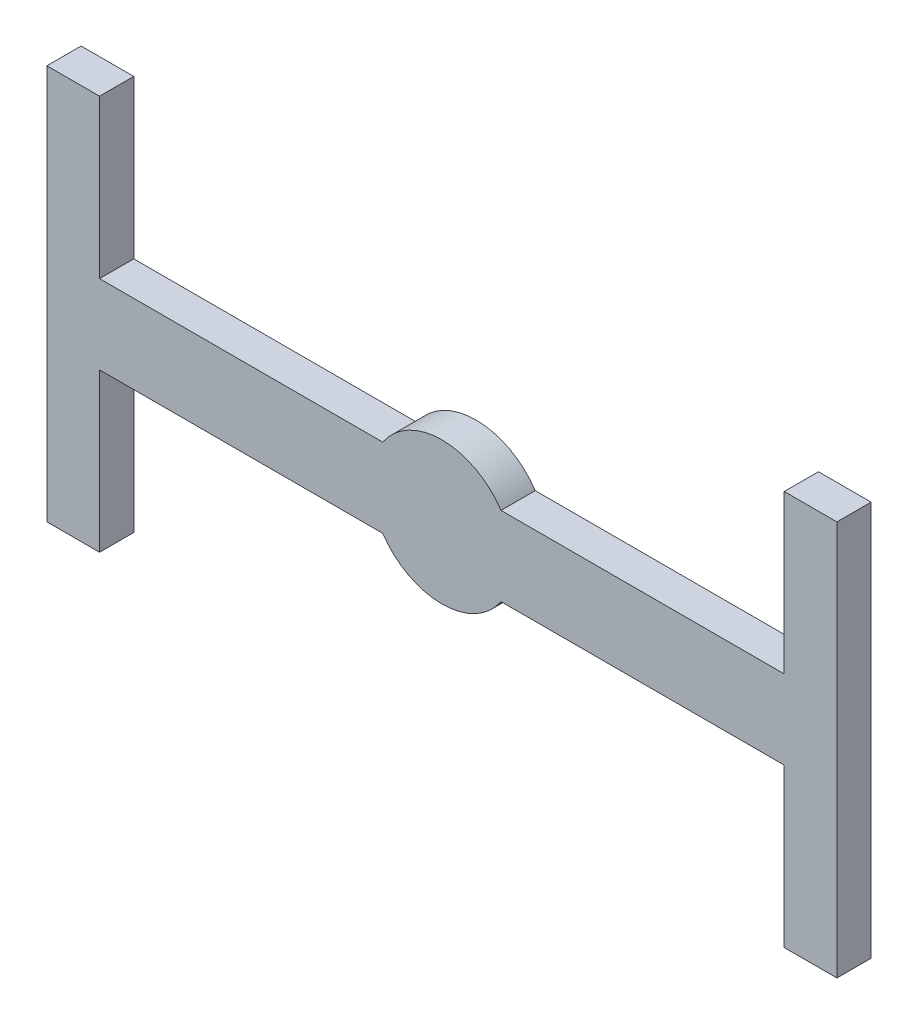
ISO-10303-21;
HEADER;
FILE_DESCRIPTION(('STEP AP214'),'2;1');
FILE_NAME('part.step','',(''),(''),'','','');
FILE_SCHEMA(('AUTOMOTIVE_DESIGN { 1 0 10303 214 1 1 1 1 }'));
ENDSEC;
DATA;
#1=APPLICATION_CONTEXT('core data for automotive mechanical design processes');
#2=APPLICATION_PROTOCOL_DEFINITION('international standard','automotive_design',2000,#1);
#3=PRODUCT_CONTEXT('',#1,'mechanical');
#4=PRODUCT('Part','Part','',(#3));
#5=PRODUCT_RELATED_PRODUCT_CATEGORY('part','',(#4));
#6=PRODUCT_DEFINITION_FORMATION('','',#4);
#7=PRODUCT_DEFINITION_CONTEXT('part definition',#1,'design');
#8=PRODUCT_DEFINITION('design','',#6,#7);
#9=PRODUCT_DEFINITION_SHAPE('','',#8);
#10=(LENGTH_UNIT() NAMED_UNIT(*) SI_UNIT(.MILLI.,.METRE.));
#11=(NAMED_UNIT(*) PLANE_ANGLE_UNIT() SI_UNIT($,.RADIAN.));
#12=(NAMED_UNIT(*) SI_UNIT($,.STERADIAN.) SOLID_ANGLE_UNIT());
#13=UNCERTAINTY_MEASURE_WITH_UNIT(LENGTH_MEASURE(1.E-05),#10,'distance_accuracy_value','');
#14=(GEOMETRIC_REPRESENTATION_CONTEXT(3) GLOBAL_UNCERTAINTY_ASSIGNED_CONTEXT((#13)) GLOBAL_UNIT_ASSIGNED_CONTEXT((#10,
#11,#12)) REPRESENTATION_CONTEXT('',''));
#15=CARTESIAN_POINT('',(0.,0.,0.));
#16=DIRECTION('',(0.,0.,1.));
#17=DIRECTION('',(1.,0.,0.));
#18=AXIS2_PLACEMENT_3D('',#15,#16,#17);
#19=CARTESIAN_POINT('',(-8.88178419700125E-13,1500.,-130.));
#20=DIRECTION('',(0.,-1.,0.));
#21=DIRECTION('',(0.,0.,-1.));
#22=AXIS2_PLACEMENT_3D('',#19,#20,#21);
#23=PLANE('',#22);
#24=DIRECTION('',(1.,0.,0.));
#25=VECTOR('',#24,1.);
#26=CARTESIAN_POINT('',(-8.88178419700125E-13,1500.,0.));
#27=LINE('',#26,#25);
#28=CARTESIAN_POINT('',(-8.88178419700125E-13,1500.,0.));
#29=VERTEX_POINT('',#28);
#30=CARTESIAN_POINT('',(200.,1500.,0.));
#31=VERTEX_POINT('',#30);
#32=EDGE_CURVE('E256',#29,#31,#27,.T.);
#33=ORIENTED_EDGE('',*,*,#32,.T.);
#34=DIRECTION('',(0.,0.,1.));
#35=VECTOR('',#34,1.);
#36=CARTESIAN_POINT('',(200.,1500.,-130.));
#37=LINE('',#36,#35);
#38=CARTESIAN_POINT('',(200.,1500.,-130.));
#39=VERTEX_POINT('',#38);
#40=EDGE_CURVE('E196',#39,#31,#37,.T.);
#41=ORIENTED_EDGE('',*,*,#40,.F.);
#42=DIRECTION('',(1.,0.,0.));
#43=VECTOR('',#42,1.);
#44=CARTESIAN_POINT('',(-8.88178419700125E-13,1500.,-130.));
#45=LINE('',#44,#43);
#46=CARTESIAN_POINT('',(-8.88178419700125E-13,1500.,-130.));
#47=VERTEX_POINT('',#46);
#48=EDGE_CURVE('E242',#47,#39,#45,.T.);
#49=ORIENTED_EDGE('',*,*,#48,.F.);
#50=DIRECTION('',(0.,0.,1.));
#51=VECTOR('',#50,1.);
#52=CARTESIAN_POINT('',(-8.88178419700125E-13,1500.,-130.));
#53=LINE('',#52,#51);
#54=EDGE_CURVE('E11',#47,#29,#53,.T.);
#55=ORIENTED_EDGE('',*,*,#54,.T.);
#56=EDGE_LOOP('',(#33,#41,#49,#55));
#57=FACE_BOUND('',#56,.T.);
#58=ADVANCED_FACE('F37',(#57),#23,.F.);
#59=CARTESIAN_POINT('',(0.,0.,-130.));
#60=DIRECTION('',(0.,-1.,0.));
#61=DIRECTION('',(0.,0.,-1.));
#62=AXIS2_PLACEMENT_3D('',#59,#60,#61);
#63=PLANE('',#62);
#64=DIRECTION('',(1.,0.,0.));
#65=VECTOR('',#64,1.);
#66=CARTESIAN_POINT('',(0.,0.,0.));
#67=LINE('',#66,#65);
#68=CARTESIAN_POINT('',(2800.,0.,0.));
#69=VERTEX_POINT('',#68);
#70=CARTESIAN_POINT('',(3000.,0.,0.));
#71=VERTEX_POINT('',#70);
#72=EDGE_CURVE('E262',#69,#71,#67,.T.);
#73=ORIENTED_EDGE('',*,*,#72,.F.);
#74=DIRECTION('',(0.,0.,1.));
#75=VECTOR('',#74,1.);
#76=CARTESIAN_POINT('',(2800.,0.,-130.));
#77=LINE('',#76,#75);
#78=CARTESIAN_POINT('',(2800.,0.,-130.));
#79=VERTEX_POINT('',#78);
#80=EDGE_CURVE('E229',#79,#69,#77,.T.);
#81=ORIENTED_EDGE('',*,*,#80,.F.);
#82=DIRECTION('',(1.,0.,0.));
#83=VECTOR('',#82,1.);
#84=CARTESIAN_POINT('',(0.,0.,-130.));
#85=LINE('',#84,#83);
#86=CARTESIAN_POINT('',(3000.,0.,-130.));
#87=VERTEX_POINT('',#86);
#88=EDGE_CURVE('E248',#79,#87,#85,.T.);
#89=ORIENTED_EDGE('',*,*,#88,.T.);
#90=DIRECTION('',(0.,0.,1.));
#91=VECTOR('',#90,1.);
#92=CARTESIAN_POINT('',(3000.,0.,-130.));
#93=LINE('',#92,#91);
#94=EDGE_CURVE('E266',#87,#71,#93,.T.);
#95=ORIENTED_EDGE('',*,*,#94,.T.);
#96=EDGE_LOOP('',(#73,#81,#89,#95));
#97=FACE_BOUND('',#96,.T.);
#98=ADVANCED_FACE('F286',(#97),#63,.T.);
#99=CARTESIAN_POINT('',(0.,0.,-130.));
#100=VERTEX_POINT('',#99);
#101=CARTESIAN_POINT('',(200.,0.,-130.));
#102=VERTEX_POINT('',#101);
#103=EDGE_CURVE('E249',#100,#102,#85,.T.);
#104=ORIENTED_EDGE('',*,*,#103,.T.);
#105=DIRECTION('',(0.,0.,1.));
#106=VECTOR('',#105,1.);
#107=CARTESIAN_POINT('',(200.,0.,-130.));
#108=LINE('',#107,#106);
#109=CARTESIAN_POINT('',(200.,0.,0.));
#110=VERTEX_POINT('',#109);
#111=EDGE_CURVE('E231',#102,#110,#108,.T.);
#112=ORIENTED_EDGE('',*,*,#111,.T.);
#113=CARTESIAN_POINT('',(0.,0.,0.));
#114=VERTEX_POINT('',#113);
#115=EDGE_CURVE('E241',#114,#110,#67,.T.);
#116=ORIENTED_EDGE('',*,*,#115,.F.);
#117=DIRECTION('',(0.,0.,1.));
#118=VECTOR('',#117,1.);
#119=CARTESIAN_POINT('',(0.,0.,-130.));
#120=LINE('',#119,#118);
#121=EDGE_CURVE('E252',#100,#114,#120,.T.);
#122=ORIENTED_EDGE('',*,*,#121,.F.);
#123=EDGE_LOOP('',(#104,#112,#116,#122));
#124=FACE_BOUND('',#123,.T.);
#125=ADVANCED_FACE('F307',(#124),#63,.T.);
#126=CARTESIAN_POINT('',(0.,0.,-130.));
#127=DIRECTION('',(0.,0.,-1.));
#128=DIRECTION('',(-1.,0.,0.));
#129=AXIS2_PLACEMENT_3D('',#126,#127,#128);
#130=PLANE('',#129);
#131=DIRECTION('',(0.,-1.,0.));
#132=VECTOR('',#131,1.);
#133=CARTESIAN_POINT('',(200.000000000001,0.,-130.));
#134=LINE('',#133,#132);
#135=CARTESIAN_POINT('',(200.,900.,-130.));
#136=VERTEX_POINT('',#135);
#137=EDGE_CURVE('E180',#39,#136,#134,.T.);
#138=ORIENTED_EDGE('',*,*,#137,.T.);
#139=DIRECTION('',(1.,0.,0.));
#140=VECTOR('',#139,1.);
#141=CARTESIAN_POINT('',(0.,900.,-130.));
#142=LINE('',#141,#140);
#143=CARTESIAN_POINT('',(1275.50055679356,900.,-130.));
#144=VERTEX_POINT('',#143);
#145=EDGE_CURVE('E159',#136,#144,#142,.T.);
#146=ORIENTED_EDGE('',*,*,#145,.T.);
#147=CARTESIAN_POINT('',(1500.,750.,-130.));
#148=DIRECTION('',(0.,0.,1.));
#149=DIRECTION('',(1.,0.,0.));
#150=AXIS2_PLACEMENT_3D('',#147,#148,#149);
#151=CIRCLE('',#150,270.);
#152=CARTESIAN_POINT('',(1724.49944320644,900.,-130.));
#153=VERTEX_POINT('',#152);
#154=EDGE_CURVE('E153',#153,#144,#151,.T.);
#155=ORIENTED_EDGE('',*,*,#154,.F.);
#156=DIRECTION('',(1.,0.,0.));
#157=VECTOR('',#156,1.);
#158=CARTESIAN_POINT('',(0.,900.,-130.));
#159=LINE('',#158,#157);
#160=CARTESIAN_POINT('',(2800.,900.,-130.));
#161=VERTEX_POINT('',#160);
#162=EDGE_CURVE('E162',#153,#161,#159,.T.);
#163=ORIENTED_EDGE('',*,*,#162,.T.);
#164=DIRECTION('',(0.,1.,0.));
#165=VECTOR('',#164,1.);
#166=CARTESIAN_POINT('',(2800.,0.,-130.));
#167=LINE('',#166,#165);
#168=CARTESIAN_POINT('',(2800.,1500.,-130.));
#169=VERTEX_POINT('',#168);
#170=EDGE_CURVE('E167',#161,#169,#167,.T.);
#171=ORIENTED_EDGE('',*,*,#170,.T.);
#172=CARTESIAN_POINT('',(3000.,1500.,-130.));
#173=VERTEX_POINT('',#172);
#174=EDGE_CURVE('E240',#169,#173,#45,.T.);
#175=ORIENTED_EDGE('',*,*,#174,.T.);
#176=DIRECTION('',(0.,1.,0.));
#177=VECTOR('',#176,1.);
#178=CARTESIAN_POINT('',(3000.,0.,-130.));
#179=LINE('',#178,#177);
#180=EDGE_CURVE('E245',#87,#173,#179,.T.);
#181=ORIENTED_EDGE('',*,*,#180,.F.);
#182=ORIENTED_EDGE('',*,*,#88,.F.);
#183=DIRECTION('',(0.,-1.,0.));
#184=VECTOR('',#183,1.);
#185=CARTESIAN_POINT('',(2800.,0.,-130.));
#186=LINE('',#185,#184);
#187=CARTESIAN_POINT('',(2800.,600.,-130.));
#188=VERTEX_POINT('',#187);
#189=EDGE_CURVE('E209',#188,#79,#186,.T.);
#190=ORIENTED_EDGE('',*,*,#189,.F.);
#191=DIRECTION('',(1.,0.,0.));
#192=VECTOR('',#191,1.);
#193=CARTESIAN_POINT('',(0.,600.,-130.));
#194=LINE('',#193,#192);
#195=CARTESIAN_POINT('',(1724.49944320644,600.,-130.));
#196=VERTEX_POINT('',#195);
#197=EDGE_CURVE('E211',#196,#188,#194,.T.);
#198=ORIENTED_EDGE('',*,*,#197,.F.);
#199=CARTESIAN_POINT('',(1500.,750.,-130.));
#200=DIRECTION('',(0.,0.,1.));
#201=DIRECTION('',(1.,0.,0.));
#202=AXIS2_PLACEMENT_3D('',#199,#200,#201);
#203=CIRCLE('',#202,270.);
#204=CARTESIAN_POINT('',(1275.50055679356,600.,-130.));
#205=VERTEX_POINT('',#204);
#206=EDGE_CURVE('E202',#205,#196,#203,.T.);
#207=ORIENTED_EDGE('',*,*,#206,.F.);
#208=DIRECTION('',(1.,0.,0.));
#209=VECTOR('',#208,1.);
#210=CARTESIAN_POINT('',(0.,600.,-130.));
#211=LINE('',#210,#209);
#212=CARTESIAN_POINT('',(200.,600.,-130.));
#213=VERTEX_POINT('',#212);
#214=EDGE_CURVE('E204',#213,#205,#211,.T.);
#215=ORIENTED_EDGE('',*,*,#214,.F.);
#216=DIRECTION('',(0.,1.,0.));
#217=VECTOR('',#216,1.);
#218=CARTESIAN_POINT('',(200.,0.,-130.));
#219=LINE('',#218,#217);
#220=EDGE_CURVE('E207',#102,#213,#219,.T.);
#221=ORIENTED_EDGE('',*,*,#220,.F.);
#222=ORIENTED_EDGE('',*,*,#103,.F.);
#223=DIRECTION('',(0.,1.,0.));
#224=VECTOR('',#223,1.);
#225=CARTESIAN_POINT('',(0.,0.,-130.));
#226=LINE('',#225,#224);
#227=EDGE_CURVE('E237',#100,#47,#226,.T.);
#228=ORIENTED_EDGE('',*,*,#227,.T.);
#229=ORIENTED_EDGE('',*,*,#48,.T.);
#230=EDGE_LOOP('',(#138,#146,#155,#163,#171,#175,#181,#182,#190,#198,#207,#215,#221,#222,#228,#229));
#231=FACE_BOUND('',#230,.T.);
#232=ADVANCED_FACE('F171',(#231),#130,.T.);
#233=CARTESIAN_POINT('',(0.,0.,0.));
#234=DIRECTION('',(0.,0.,-1.));
#235=DIRECTION('',(-1.,0.,0.));
#236=AXIS2_PLACEMENT_3D('',#233,#234,#235);
#237=PLANE('',#236);
#238=DIRECTION('',(1.,0.,0.));
#239=VECTOR('',#238,1.);
#240=CARTESIAN_POINT('',(0.,900.,0.));
#241=LINE('',#240,#239);
#242=CARTESIAN_POINT('',(200.,900.,0.));
#243=VERTEX_POINT('',#242);
#244=CARTESIAN_POINT('',(1275.50055679356,900.,0.));
#245=VERTEX_POINT('',#244);
#246=EDGE_CURVE('E173',#243,#245,#241,.T.);
#247=ORIENTED_EDGE('',*,*,#246,.F.);
#248=DIRECTION('',(0.,-1.,0.));
#249=VECTOR('',#248,1.);
#250=CARTESIAN_POINT('',(200.000000000001,0.,0.));
#251=LINE('',#250,#249);
#252=EDGE_CURVE('E176',#31,#243,#251,.T.);
#253=ORIENTED_EDGE('',*,*,#252,.F.);
#254=ORIENTED_EDGE('',*,*,#32,.F.);
#255=DIRECTION('',(0.,1.,0.));
#256=VECTOR('',#255,1.);
#257=CARTESIAN_POINT('',(0.,0.,0.));
#258=LINE('',#257,#256);
#259=EDGE_CURVE('E193',#114,#29,#258,.T.);
#260=ORIENTED_EDGE('',*,*,#259,.F.);
#261=ORIENTED_EDGE('',*,*,#115,.T.);
#262=DIRECTION('',(0.,1.,0.));
#263=VECTOR('',#262,1.);
#264=CARTESIAN_POINT('',(200.,0.,0.));
#265=LINE('',#264,#263);
#266=CARTESIAN_POINT('',(200.,600.,0.));
#267=VERTEX_POINT('',#266);
#268=EDGE_CURVE('E218',#110,#267,#265,.T.);
#269=ORIENTED_EDGE('',*,*,#268,.T.);
#270=DIRECTION('',(1.,0.,0.));
#271=VECTOR('',#270,1.);
#272=CARTESIAN_POINT('',(0.,600.,0.));
#273=LINE('',#272,#271);
#274=CARTESIAN_POINT('',(1275.50055679356,600.,0.));
#275=VERTEX_POINT('',#274);
#276=EDGE_CURVE('E215',#267,#275,#273,.T.);
#277=ORIENTED_EDGE('',*,*,#276,.T.);
#278=CARTESIAN_POINT('',(1500.,750.,0.));
#279=DIRECTION('',(0.,0.,1.));
#280=DIRECTION('',(1.,0.,0.));
#281=AXIS2_PLACEMENT_3D('',#278,#279,#280);
#282=CIRCLE('',#281,270.);
#283=CARTESIAN_POINT('',(1724.49944320644,600.,0.));
#284=VERTEX_POINT('',#283);
#285=EDGE_CURVE('E60',#275,#284,#282,.T.);
#286=ORIENTED_EDGE('',*,*,#285,.T.);
#287=DIRECTION('',(1.,0.,0.));
#288=VECTOR('',#287,1.);
#289=CARTESIAN_POINT('',(0.,600.,0.));
#290=LINE('',#289,#288);
#291=CARTESIAN_POINT('',(2800.,600.,0.));
#292=VERTEX_POINT('',#291);
#293=EDGE_CURVE('E205',#284,#292,#290,.T.);
#294=ORIENTED_EDGE('',*,*,#293,.T.);
#295=DIRECTION('',(0.,-1.,0.));
#296=VECTOR('',#295,1.);
#297=CARTESIAN_POINT('',(2800.,0.,0.));
#298=LINE('',#297,#296);
#299=EDGE_CURVE('E221',#292,#69,#298,.T.);
#300=ORIENTED_EDGE('',*,*,#299,.T.);
#301=ORIENTED_EDGE('',*,*,#72,.T.);
#302=DIRECTION('',(0.,1.,0.));
#303=VECTOR('',#302,1.);
#304=CARTESIAN_POINT('',(3000.,0.,0.));
#305=LINE('',#304,#303);
#306=CARTESIAN_POINT('',(3000.,1500.,0.));
#307=VERTEX_POINT('',#306);
#308=EDGE_CURVE('E259',#71,#307,#305,.T.);
#309=ORIENTED_EDGE('',*,*,#308,.T.);
#310=CARTESIAN_POINT('',(2800.,1500.,0.));
#311=VERTEX_POINT('',#310);
#312=EDGE_CURVE('E255',#311,#307,#27,.T.);
#313=ORIENTED_EDGE('',*,*,#312,.F.);
#314=DIRECTION('',(0.,1.,0.));
#315=VECTOR('',#314,1.);
#316=CARTESIAN_POINT('',(2800.,0.,0.));
#317=LINE('',#316,#315);
#318=CARTESIAN_POINT('',(2800.,900.,0.));
#319=VERTEX_POINT('',#318);
#320=EDGE_CURVE('E187',#319,#311,#317,.T.);
#321=ORIENTED_EDGE('',*,*,#320,.F.);
#322=DIRECTION('',(1.,0.,0.));
#323=VECTOR('',#322,1.);
#324=CARTESIAN_POINT('',(0.,900.,0.));
#325=LINE('',#324,#323);
#326=CARTESIAN_POINT('',(1724.49944320644,900.,0.));
#327=VERTEX_POINT('',#326);
#328=EDGE_CURVE('E184',#327,#319,#325,.T.);
#329=ORIENTED_EDGE('',*,*,#328,.F.);
#330=CARTESIAN_POINT('',(1500.,750.,0.));
#331=DIRECTION('',(0.,0.,1.));
#332=DIRECTION('',(1.,0.,0.));
#333=AXIS2_PLACEMENT_3D('',#330,#331,#332);
#334=CIRCLE('',#333,270.);
#335=EDGE_CURVE('E52',#327,#245,#334,.T.);
#336=ORIENTED_EDGE('',*,*,#335,.T.);
#337=EDGE_LOOP('',(#247,#253,#254,#260,#261,#269,#277,#286,#294,#300,#301,#309,#313,#321,#329,#336));
#338=FACE_BOUND('',#337,.T.);
#339=ADVANCED_FACE('F280',(#338),#237,.F.);
#340=CARTESIAN_POINT('',(0.,0.,-130.));
#341=DIRECTION('',(1.,0.,0.));
#342=DIRECTION('',(0.,1.,0.));
#343=AXIS2_PLACEMENT_3D('',#340,#341,#342);
#344=PLANE('',#343);
#345=ORIENTED_EDGE('',*,*,#259,.T.);
#346=ORIENTED_EDGE('',*,*,#54,.F.);
#347=ORIENTED_EDGE('',*,*,#227,.F.);
#348=ORIENTED_EDGE('',*,*,#121,.T.);
#349=EDGE_LOOP('',(#345,#346,#347,#348));
#350=FACE_BOUND('',#349,.T.);
#351=ADVANCED_FACE('F39',(#350),#344,.F.);
#352=ORIENTED_EDGE('',*,*,#174,.F.);
#353=DIRECTION('',(0.,0.,1.));
#354=VECTOR('',#353,1.);
#355=CARTESIAN_POINT('',(2800.,1500.,-130.));
#356=LINE('',#355,#354);
#357=EDGE_CURVE('E198',#169,#311,#356,.T.);
#358=ORIENTED_EDGE('',*,*,#357,.T.);
#359=ORIENTED_EDGE('',*,*,#312,.T.);
#360=DIRECTION('',(0.,0.,1.));
#361=VECTOR('',#360,1.);
#362=CARTESIAN_POINT('',(3000.,1500.,-130.));
#363=LINE('',#362,#361);
#364=EDGE_CURVE('E45',#173,#307,#363,.T.);
#365=ORIENTED_EDGE('',*,*,#364,.F.);
#366=EDGE_LOOP('',(#352,#358,#359,#365));
#367=FACE_BOUND('',#366,.T.);
#368=ADVANCED_FACE('F289',(#367),#23,.F.);
#369=CARTESIAN_POINT('',(3000.,0.,-130.));
#370=DIRECTION('',(1.,0.,0.));
#371=DIRECTION('',(0.,1.,0.));
#372=AXIS2_PLACEMENT_3D('',#369,#370,#371);
#373=PLANE('',#372);
#374=ORIENTED_EDGE('',*,*,#308,.F.);
#375=ORIENTED_EDGE('',*,*,#94,.F.);
#376=ORIENTED_EDGE('',*,*,#180,.T.);
#377=ORIENTED_EDGE('',*,*,#364,.T.);
#378=EDGE_LOOP('',(#374,#375,#376,#377));
#379=FACE_BOUND('',#378,.T.);
#380=ADVANCED_FACE('F272',(#379),#373,.T.);
#381=CARTESIAN_POINT('',(1500.,750.,-130.));
#382=DIRECTION('',(0.,0.,1.));
#383=DIRECTION('',(1.,0.,0.));
#384=AXIS2_PLACEMENT_3D('',#381,#382,#383);
#385=CYLINDRICAL_SURFACE('',#384,270.);
#386=ORIENTED_EDGE('',*,*,#285,.F.);
#387=DIRECTION('',(0.,0.,1.));
#388=VECTOR('',#387,1.);
#389=CARTESIAN_POINT('',(1275.50055679356,600.,-130.));
#390=LINE('',#389,#388);
#391=EDGE_CURVE('E213',#205,#275,#390,.T.);
#392=ORIENTED_EDGE('',*,*,#391,.F.);
#393=ORIENTED_EDGE('',*,*,#206,.T.);
#394=DIRECTION('',(0.,0.,1.));
#395=VECTOR('',#394,1.);
#396=CARTESIAN_POINT('',(1724.49944320644,600.,-130.));
#397=LINE('',#396,#395);
#398=EDGE_CURVE('E185',#196,#284,#397,.T.);
#399=ORIENTED_EDGE('',*,*,#398,.T.);
#400=EDGE_LOOP('',(#386,#392,#393,#399));
#401=FACE_BOUND('',#400,.T.);
#402=ADVANCED_FACE('F317',(#401),#385,.T.);
#403=CARTESIAN_POINT('',(0.,600.,-130.));
#404=DIRECTION('',(0.,-1.,0.));
#405=DIRECTION('',(0.,0.,-1.));
#406=AXIS2_PLACEMENT_3D('',#403,#404,#405);
#407=PLANE('',#406);
#408=ORIENTED_EDGE('',*,*,#293,.F.);
#409=ORIENTED_EDGE('',*,*,#398,.F.);
#410=ORIENTED_EDGE('',*,*,#197,.T.);
#411=DIRECTION('',(0.,0.,1.));
#412=VECTOR('',#411,1.);
#413=CARTESIAN_POINT('',(2800.,600.,-130.));
#414=LINE('',#413,#412);
#415=EDGE_CURVE('E227',#188,#292,#414,.T.);
#416=ORIENTED_EDGE('',*,*,#415,.T.);
#417=EDGE_LOOP('',(#408,#409,#410,#416));
#418=FACE_BOUND('',#417,.T.);
#419=ADVANCED_FACE('F320',(#418),#407,.T.);
#420=CARTESIAN_POINT('',(2800.,0.,-130.));
#421=DIRECTION('',(-1.,0.,0.));
#422=DIRECTION('',(0.,0.,1.));
#423=AXIS2_PLACEMENT_3D('',#420,#421,#422);
#424=PLANE('',#423);
#425=ORIENTED_EDGE('',*,*,#299,.F.);
#426=ORIENTED_EDGE('',*,*,#415,.F.);
#427=ORIENTED_EDGE('',*,*,#189,.T.);
#428=ORIENTED_EDGE('',*,*,#80,.T.);
#429=EDGE_LOOP('',(#425,#426,#427,#428));
#430=FACE_BOUND('',#429,.T.);
#431=ADVANCED_FACE('F323',(#430),#424,.T.);
#432=CARTESIAN_POINT('',(200.,0.,-130.));
#433=DIRECTION('',(1.,0.,0.));
#434=DIRECTION('',(0.,1.,0.));
#435=AXIS2_PLACEMENT_3D('',#432,#433,#434);
#436=PLANE('',#435);
#437=ORIENTED_EDGE('',*,*,#268,.F.);
#438=ORIENTED_EDGE('',*,*,#111,.F.);
#439=ORIENTED_EDGE('',*,*,#220,.T.);
#440=DIRECTION('',(0.,0.,1.));
#441=VECTOR('',#440,1.);
#442=CARTESIAN_POINT('',(200.,600.,-130.));
#443=LINE('',#442,#441);
#444=EDGE_CURVE('E234',#213,#267,#443,.T.);
#445=ORIENTED_EDGE('',*,*,#444,.T.);
#446=EDGE_LOOP('',(#437,#438,#439,#445));
#447=FACE_BOUND('',#446,.T.);
#448=ADVANCED_FACE('F309',(#447),#436,.T.);
#449=CARTESIAN_POINT('',(0.,600.,-130.));
#450=DIRECTION('',(0.,-1.,0.));
#451=DIRECTION('',(0.,0.,-1.));
#452=AXIS2_PLACEMENT_3D('',#449,#450,#451);
#453=PLANE('',#452);
#454=ORIENTED_EDGE('',*,*,#276,.F.);
#455=ORIENTED_EDGE('',*,*,#444,.F.);
#456=ORIENTED_EDGE('',*,*,#214,.T.);
#457=ORIENTED_EDGE('',*,*,#391,.T.);
#458=EDGE_LOOP('',(#454,#455,#456,#457));
#459=FACE_BOUND('',#458,.T.);
#460=ADVANCED_FACE('F316',(#459),#453,.T.);
#461=CARTESIAN_POINT('',(1500.,750.,-130.));
#462=DIRECTION('',(0.,0.,1.));
#463=DIRECTION('',(1.,0.,0.));
#464=AXIS2_PLACEMENT_3D('',#461,#462,#463);
#465=CYLINDRICAL_SURFACE('',#464,270.);
#466=ORIENTED_EDGE('',*,*,#335,.F.);
#467=DIRECTION('',(0.,0.,1.));
#468=VECTOR('',#467,1.);
#469=CARTESIAN_POINT('',(1724.49944320644,900.,-130.));
#470=LINE('',#469,#468);
#471=EDGE_CURVE('E149',#153,#327,#470,.T.);
#472=ORIENTED_EDGE('',*,*,#471,.F.);
#473=ORIENTED_EDGE('',*,*,#154,.T.);
#474=DIRECTION('',(0.,0.,1.));
#475=VECTOR('',#474,1.);
#476=CARTESIAN_POINT('',(1275.50055679356,900.,-130.));
#477=LINE('',#476,#475);
#478=EDGE_CURVE('E191',#144,#245,#477,.T.);
#479=ORIENTED_EDGE('',*,*,#478,.T.);
#480=EDGE_LOOP('',(#466,#472,#473,#479));
#481=FACE_BOUND('',#480,.T.);
#482=ADVANCED_FACE('F151',(#481),#465,.T.);
#483=CARTESIAN_POINT('',(0.,900.,-130.));
#484=DIRECTION('',(0.,-1.,0.));
#485=DIRECTION('',(0.,0.,-1.));
#486=AXIS2_PLACEMENT_3D('',#483,#484,#485);
#487=PLANE('',#486);
#488=ORIENTED_EDGE('',*,*,#246,.T.);
#489=ORIENTED_EDGE('',*,*,#478,.F.);
#490=ORIENTED_EDGE('',*,*,#145,.F.);
#491=DIRECTION('',(0.,0.,1.));
#492=VECTOR('',#491,1.);
#493=CARTESIAN_POINT('',(200.,900.,-130.));
#494=LINE('',#493,#492);
#495=EDGE_CURVE('E194',#136,#243,#494,.T.);
#496=ORIENTED_EDGE('',*,*,#495,.T.);
#497=EDGE_LOOP('',(#488,#489,#490,#496));
#498=FACE_BOUND('',#497,.T.);
#499=ADVANCED_FACE('F294',(#498),#487,.F.);
#500=CARTESIAN_POINT('',(200.000000000001,0.,-130.));
#501=DIRECTION('',(-1.,0.,0.));
#502=DIRECTION('',(0.,-1.,0.));
#503=AXIS2_PLACEMENT_3D('',#500,#501,#502);
#504=PLANE('',#503);
#505=ORIENTED_EDGE('',*,*,#252,.T.);
#506=ORIENTED_EDGE('',*,*,#495,.F.);
#507=ORIENTED_EDGE('',*,*,#137,.F.);
#508=ORIENTED_EDGE('',*,*,#40,.T.);
#509=EDGE_LOOP('',(#505,#506,#507,#508));
#510=FACE_BOUND('',#509,.T.);
#511=ADVANCED_FACE('F296',(#510),#504,.F.);
#512=CARTESIAN_POINT('',(2800.,0.,-130.));
#513=DIRECTION('',(1.,0.,0.));
#514=DIRECTION('',(0.,0.,-1.));
#515=AXIS2_PLACEMENT_3D('',#512,#513,#514);
#516=PLANE('',#515);
#517=ORIENTED_EDGE('',*,*,#320,.T.);
#518=ORIENTED_EDGE('',*,*,#357,.F.);
#519=ORIENTED_EDGE('',*,*,#170,.F.);
#520=DIRECTION('',(0.,0.,1.));
#521=VECTOR('',#520,1.);
#522=CARTESIAN_POINT('',(2800.,900.,-130.));
#523=LINE('',#522,#521);
#524=EDGE_CURVE('E158',#161,#319,#523,.T.);
#525=ORIENTED_EDGE('',*,*,#524,.T.);
#526=EDGE_LOOP('',(#517,#518,#519,#525));
#527=FACE_BOUND('',#526,.T.);
#528=ADVANCED_FACE('F291',(#527),#516,.F.);
#529=CARTESIAN_POINT('',(0.,900.,-130.));
#530=DIRECTION('',(0.,-1.,0.));
#531=DIRECTION('',(0.,0.,-1.));
#532=AXIS2_PLACEMENT_3D('',#529,#530,#531);
#533=PLANE('',#532);
#534=ORIENTED_EDGE('',*,*,#328,.T.);
#535=ORIENTED_EDGE('',*,*,#524,.F.);
#536=ORIENTED_EDGE('',*,*,#162,.F.);
#537=ORIENTED_EDGE('',*,*,#471,.T.);
#538=EDGE_LOOP('',(#534,#535,#536,#537));
#539=FACE_BOUND('',#538,.T.);
#540=ADVANCED_FACE('F163',(#539),#533,.F.);
#541=CLOSED_SHELL('',(#58,#98,#125,#232,#339,#351,#368,#380,#402,#419,#431,#448,#460,#482,#499,
#511,#528,#540));
#542=MANIFOLD_SOLID_BREP('B2',#541);
#543=ADVANCED_BREP_SHAPE_REPRESENTATION('',(#18,#542),#14);
#544=SHAPE_DEFINITION_REPRESENTATION(#9,#543);
ENDSEC;
END-ISO-10303-21;
